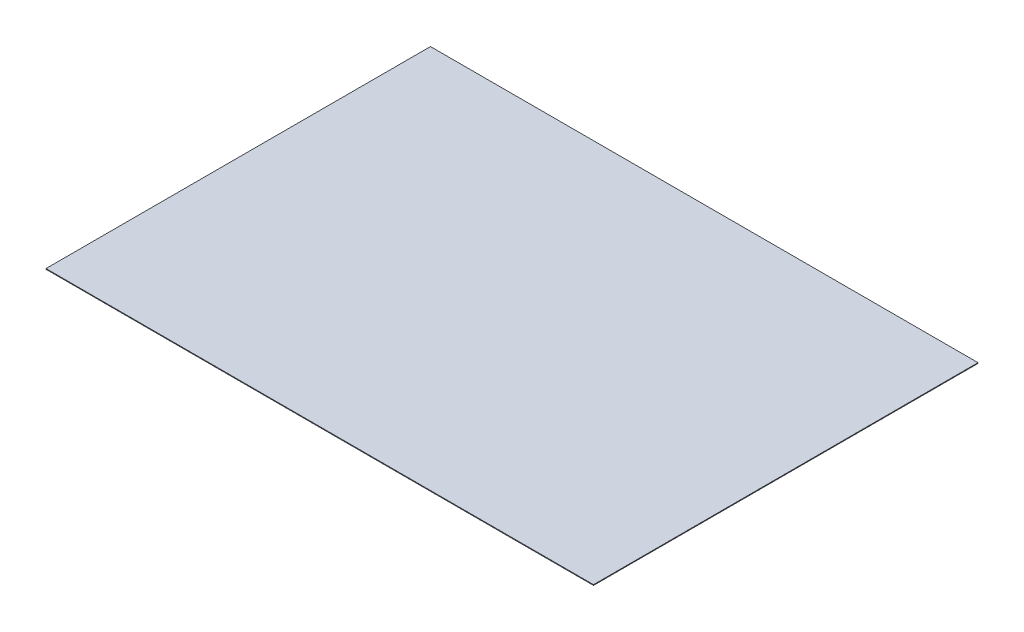
ISO-10303-21;
HEADER;
FILE_DESCRIPTION(('STEP AP214'),'2;1');
FILE_NAME('part.step','',(''),(''),'','','');
FILE_SCHEMA(('AUTOMOTIVE_DESIGN { 1 0 10303 214 1 1 1 1 }'));
ENDSEC;
DATA;
#1=APPLICATION_CONTEXT('core data for automotive mechanical design processes');
#2=APPLICATION_PROTOCOL_DEFINITION('international standard','automotive_design',2000,#1);
#3=PRODUCT_CONTEXT('',#1,'mechanical');
#4=PRODUCT('Part','Part','',(#3));
#5=PRODUCT_RELATED_PRODUCT_CATEGORY('part','',(#4));
#6=PRODUCT_DEFINITION_FORMATION('','',#4);
#7=PRODUCT_DEFINITION_CONTEXT('part definition',#1,'design');
#8=PRODUCT_DEFINITION('design','',#6,#7);
#9=PRODUCT_DEFINITION_SHAPE('','',#8);
#10=(LENGTH_UNIT() NAMED_UNIT(*) SI_UNIT(.MILLI.,.METRE.));
#11=(NAMED_UNIT(*) PLANE_ANGLE_UNIT() SI_UNIT($,.RADIAN.));
#12=(NAMED_UNIT(*) SI_UNIT($,.STERADIAN.) SOLID_ANGLE_UNIT());
#13=UNCERTAINTY_MEASURE_WITH_UNIT(LENGTH_MEASURE(1.E-05),#10,'distance_accuracy_value','');
#14=(GEOMETRIC_REPRESENTATION_CONTEXT(3) GLOBAL_UNCERTAINTY_ASSIGNED_CONTEXT((#13)) GLOBAL_UNIT_ASSIGNED_CONTEXT((#10,
#11,#12)) REPRESENTATION_CONTEXT('',''));
#15=CARTESIAN_POINT('',(0.,0.,0.));
#16=DIRECTION('',(0.,0.,1.));
#17=DIRECTION('',(1.,0.,0.));
#18=AXIS2_PLACEMENT_3D('',#15,#16,#17);
#19=CARTESIAN_POINT('',(-783.25,2.,550.));
#20=DIRECTION('',(1.,0.,0.));
#21=DIRECTION('',(0.,0.,-1.));
#22=AXIS2_PLACEMENT_3D('',#19,#20,#21);
#23=PLANE('',#22);
#24=DIRECTION('',(0.,0.,1.));
#25=VECTOR('',#24,1.);
#26=CARTESIAN_POINT('',(-783.25,0.,550.));
#27=LINE('',#26,#25);
#28=CARTESIAN_POINT('',(-783.25,0.,-550.));
#29=VERTEX_POINT('',#28);
#30=CARTESIAN_POINT('',(-783.25,0.,550.));
#31=VERTEX_POINT('',#30);
#32=EDGE_CURVE('E94',#29,#31,#27,.T.);
#33=ORIENTED_EDGE('',*,*,#32,.T.);
#34=DIRECTION('',(0.,-1.,0.));
#35=VECTOR('',#34,1.);
#36=CARTESIAN_POINT('',(-783.25,2.,550.));
#37=LINE('',#36,#35);
#38=CARTESIAN_POINT('',(-783.25,2.,550.));
#39=VERTEX_POINT('',#38);
#40=EDGE_CURVE('E11',#39,#31,#37,.T.);
#41=ORIENTED_EDGE('',*,*,#40,.F.);
#42=DIRECTION('',(0.,0.,1.));
#43=VECTOR('',#42,1.);
#44=CARTESIAN_POINT('',(-783.25,2.,550.));
#45=LINE('',#44,#43);
#46=CARTESIAN_POINT('',(-783.25,2.,-550.));
#47=VERTEX_POINT('',#46);
#48=EDGE_CURVE('E82',#47,#39,#45,.T.);
#49=ORIENTED_EDGE('',*,*,#48,.F.);
#50=DIRECTION('',(0.,-1.,0.));
#51=VECTOR('',#50,1.);
#52=CARTESIAN_POINT('',(-783.25,2.,-550.));
#53=LINE('',#52,#51);
#54=EDGE_CURVE('E90',#47,#29,#53,.T.);
#55=ORIENTED_EDGE('',*,*,#54,.T.);
#56=EDGE_LOOP('',(#33,#41,#49,#55));
#57=FACE_BOUND('',#56,.T.);
#58=ADVANCED_FACE('F31',(#57),#23,.F.);
#59=CARTESIAN_POINT('',(783.25,2.,550.));
#60=DIRECTION('',(0.,0.,-1.));
#61=DIRECTION('',(-1.,0.,0.));
#62=AXIS2_PLACEMENT_3D('',#59,#60,#61);
#63=PLANE('',#62);
#64=DIRECTION('',(1.,0.,0.));
#65=VECTOR('',#64,1.);
#66=CARTESIAN_POINT('',(783.25,0.,550.));
#67=LINE('',#66,#65);
#68=CARTESIAN_POINT('',(783.25,0.,550.));
#69=VERTEX_POINT('',#68);
#70=EDGE_CURVE('E86',#31,#69,#67,.T.);
#71=ORIENTED_EDGE('',*,*,#70,.T.);
#72=DIRECTION('',(0.,-1.,0.));
#73=VECTOR('',#72,1.);
#74=CARTESIAN_POINT('',(783.25,2.,550.));
#75=LINE('',#74,#73);
#76=CARTESIAN_POINT('',(783.25,2.,550.));
#77=VERTEX_POINT('',#76);
#78=EDGE_CURVE('E39',#77,#69,#75,.T.);
#79=ORIENTED_EDGE('',*,*,#78,.F.);
#80=DIRECTION('',(1.,0.,0.));
#81=VECTOR('',#80,1.);
#82=CARTESIAN_POINT('',(783.25,2.,550.));
#83=LINE('',#82,#81);
#84=EDGE_CURVE('E77',#39,#77,#83,.T.);
#85=ORIENTED_EDGE('',*,*,#84,.F.);
#86=ORIENTED_EDGE('',*,*,#40,.T.);
#87=EDGE_LOOP('',(#71,#79,#85,#86));
#88=FACE_BOUND('',#87,.T.);
#89=ADVANCED_FACE('F85',(#88),#63,.F.);
#90=CARTESIAN_POINT('',(783.25,2.,550.));
#91=DIRECTION('',(-1.,0.,0.));
#92=DIRECTION('',(0.,0.,1.));
#93=AXIS2_PLACEMENT_3D('',#90,#91,#92);
#94=PLANE('',#93);
#95=DIRECTION('',(0.,0.,-1.));
#96=VECTOR('',#95,1.);
#97=CARTESIAN_POINT('',(783.25,0.,550.));
#98=LINE('',#97,#96);
#99=CARTESIAN_POINT('',(783.25,0.,-550.));
#100=VERTEX_POINT('',#99);
#101=EDGE_CURVE('E64',#69,#100,#98,.T.);
#102=ORIENTED_EDGE('',*,*,#101,.T.);
#103=DIRECTION('',(0.,-1.,0.));
#104=VECTOR('',#103,1.);
#105=CARTESIAN_POINT('',(783.25,2.,-550.));
#106=LINE('',#105,#104);
#107=CARTESIAN_POINT('',(783.25,2.,-550.));
#108=VERTEX_POINT('',#107);
#109=EDGE_CURVE('E87',#108,#100,#106,.T.);
#110=ORIENTED_EDGE('',*,*,#109,.F.);
#111=DIRECTION('',(0.,0.,-1.));
#112=VECTOR('',#111,1.);
#113=CARTESIAN_POINT('',(783.25,2.,550.));
#114=LINE('',#113,#112);
#115=EDGE_CURVE('E80',#77,#108,#114,.T.);
#116=ORIENTED_EDGE('',*,*,#115,.F.);
#117=ORIENTED_EDGE('',*,*,#78,.T.);
#118=EDGE_LOOP('',(#102,#110,#116,#117));
#119=FACE_BOUND('',#118,.T.);
#120=ADVANCED_FACE('F88',(#119),#94,.F.);
#121=CARTESIAN_POINT('',(783.25,2.,-550.));
#122=DIRECTION('',(0.,0.,1.));
#123=DIRECTION('',(1.,0.,0.));
#124=AXIS2_PLACEMENT_3D('',#121,#122,#123);
#125=PLANE('',#124);
#126=DIRECTION('',(-1.,0.,0.));
#127=VECTOR('',#126,1.);
#128=CARTESIAN_POINT('',(783.25,0.,-550.));
#129=LINE('',#128,#127);
#130=EDGE_CURVE('E70',#100,#29,#129,.T.);
#131=ORIENTED_EDGE('',*,*,#130,.T.);
#132=ORIENTED_EDGE('',*,*,#54,.F.);
#133=DIRECTION('',(-1.,0.,0.));
#134=VECTOR('',#133,1.);
#135=CARTESIAN_POINT('',(783.25,2.,-550.));
#136=LINE('',#135,#134);
#137=EDGE_CURVE('E47',#108,#47,#136,.T.);
#138=ORIENTED_EDGE('',*,*,#137,.F.);
#139=ORIENTED_EDGE('',*,*,#109,.T.);
#140=EDGE_LOOP('',(#131,#132,#138,#139));
#141=FACE_BOUND('',#140,.T.);
#142=ADVANCED_FACE('F101',(#141),#125,.F.);
#143=CARTESIAN_POINT('',(-783.25,2.,-550.));
#144=DIRECTION('',(0.,1.,0.));
#145=DIRECTION('',(0.,0.,1.));
#146=AXIS2_PLACEMENT_3D('',#143,#144,#145);
#147=PLANE('',#146);
#148=ORIENTED_EDGE('',*,*,#48,.T.);
#149=ORIENTED_EDGE('',*,*,#84,.T.);
#150=ORIENTED_EDGE('',*,*,#115,.T.);
#151=ORIENTED_EDGE('',*,*,#137,.T.);
#152=EDGE_LOOP('',(#148,#149,#150,#151));
#153=FACE_BOUND('',#152,.T.);
#154=ADVANCED_FACE('F78',(#153),#147,.T.);
#155=CARTESIAN_POINT('',(-783.25,0.,-550.));
#156=DIRECTION('',(0.,1.,0.));
#157=DIRECTION('',(0.,0.,1.));
#158=AXIS2_PLACEMENT_3D('',#155,#156,#157);
#159=PLANE('',#158);
#160=ORIENTED_EDGE('',*,*,#32,.F.);
#161=ORIENTED_EDGE('',*,*,#130,.F.);
#162=ORIENTED_EDGE('',*,*,#101,.F.);
#163=ORIENTED_EDGE('',*,*,#70,.F.);
#164=EDGE_LOOP('',(#160,#161,#162,#163));
#165=FACE_BOUND('',#164,.T.);
#166=ADVANCED_FACE('F104',(#165),#159,.F.);
#167=CLOSED_SHELL('',(#58,#89,#120,#142,#154,#166));
#168=MANIFOLD_SOLID_BREP('B2',#167);
#169=ADVANCED_BREP_SHAPE_REPRESENTATION('',(#18,#168),#14);
#170=SHAPE_DEFINITION_REPRESENTATION(#9,#169);
ENDSEC;
END-ISO-10303-21;
